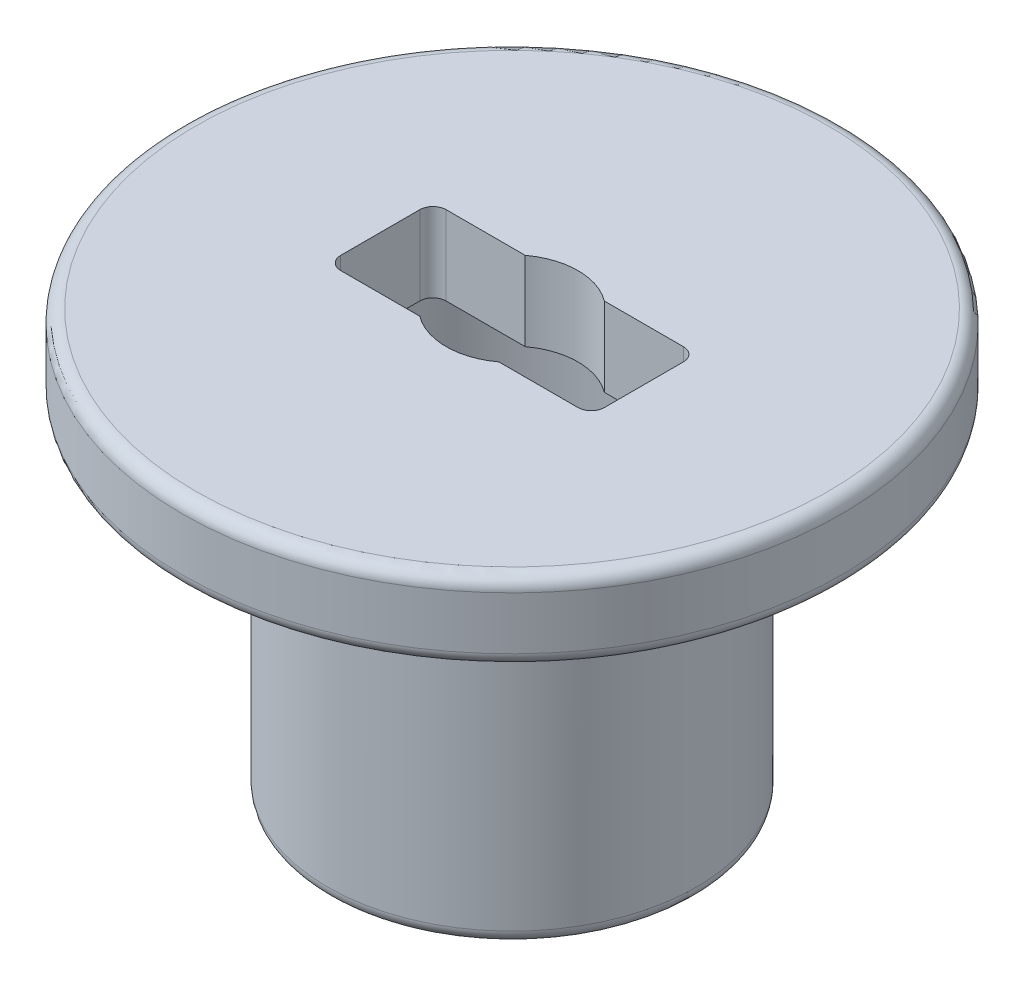
ISO-10303-21;
HEADER;
FILE_DESCRIPTION(('STEP AP214'),'2;1');
FILE_NAME('part.step','',(''),(''),'','','');
FILE_SCHEMA(('AUTOMOTIVE_DESIGN { 1 0 10303 214 1 1 1 1 }'));
ENDSEC;
DATA;
#1=APPLICATION_CONTEXT('core data for automotive mechanical design processes');
#2=APPLICATION_PROTOCOL_DEFINITION('international standard','automotive_design',2000,#1);
#3=PRODUCT_CONTEXT('',#1,'mechanical');
#4=PRODUCT('Part','Part','',(#3));
#5=PRODUCT_RELATED_PRODUCT_CATEGORY('part','',(#4));
#6=PRODUCT_DEFINITION_FORMATION('','',#4);
#7=PRODUCT_DEFINITION_CONTEXT('part definition',#1,'design');
#8=PRODUCT_DEFINITION('design','',#6,#7);
#9=PRODUCT_DEFINITION_SHAPE('','',#8);
#10=(LENGTH_UNIT() NAMED_UNIT(*) SI_UNIT(.MILLI.,.METRE.));
#11=(NAMED_UNIT(*) PLANE_ANGLE_UNIT() SI_UNIT($,.RADIAN.));
#12=(NAMED_UNIT(*) SI_UNIT($,.STERADIAN.) SOLID_ANGLE_UNIT());
#13=UNCERTAINTY_MEASURE_WITH_UNIT(LENGTH_MEASURE(1.E-05),#10,'distance_accuracy_value','');
#14=(GEOMETRIC_REPRESENTATION_CONTEXT(3) GLOBAL_UNCERTAINTY_ASSIGNED_CONTEXT((#13)) GLOBAL_UNIT_ASSIGNED_CONTEXT((#10,
#11,#12)) REPRESENTATION_CONTEXT('',''));
#15=CARTESIAN_POINT('',(0.,0.,0.));
#16=DIRECTION('',(0.,0.,1.));
#17=DIRECTION('',(1.,0.,0.));
#18=AXIS2_PLACEMENT_3D('',#15,#16,#17);
#19=CARTESIAN_POINT('',(0.,3.,0.));
#20=DIRECTION('',(0.,1.,0.));
#21=DIRECTION('',(0.,0.,1.));
#22=AXIS2_PLACEMENT_3D('',#19,#20,#21);
#23=PLANE('',#22);
#24=CARTESIAN_POINT('',(0.,3.,0.));
#25=DIRECTION('',(0.,1.,0.));
#26=DIRECTION('',(0.,0.,1.));
#27=AXIS2_PLACEMENT_3D('',#24,#25,#26);
#28=CIRCLE('',#27,12.);
#29=CARTESIAN_POINT('',(0.,3.,12.));
#30=VERTEX_POINT('',#29);
#31=EDGE_CURVE('E211',#30,#30,#28,.T.);
#32=ORIENTED_EDGE('',*,*,#31,.T.);
#33=EDGE_LOOP('',(#32));
#34=FACE_BOUND('',#33,.T.);
#35=DIRECTION('',(1.,0.,0.));
#36=VECTOR('',#35,1.);
#37=CARTESIAN_POINT('',(1.5,3.,2.));
#38=LINE('',#37,#36);
#39=CARTESIAN_POINT('',(1.5,3.,2.));
#40=VERTEX_POINT('',#39);
#41=CARTESIAN_POINT('',(4.5,3.,2.));
#42=VERTEX_POINT('',#41);
#43=EDGE_CURVE('E325',#40,#42,#38,.T.);
#44=ORIENTED_EDGE('',*,*,#43,.F.);
#45=CARTESIAN_POINT('',(0.,3.,0.));
#46=DIRECTION('',(0.,1.,0.));
#47=DIRECTION('',(0.,0.,1.));
#48=AXIS2_PLACEMENT_3D('',#45,#46,#47);
#49=CIRCLE('',#48,2.5);
#50=CARTESIAN_POINT('',(-1.5,3.,2.));
#51=VERTEX_POINT('',#50);
#52=EDGE_CURVE('E170',#51,#40,#49,.T.);
#53=ORIENTED_EDGE('',*,*,#52,.F.);
#54=DIRECTION('',(1.,0.,0.));
#55=VECTOR('',#54,1.);
#56=CARTESIAN_POINT('',(-4.49999999999999,3.,2.));
#57=LINE('',#56,#55);
#58=CARTESIAN_POINT('',(-4.49999999999999,3.,2.));
#59=VERTEX_POINT('',#58);
#60=EDGE_CURVE('E57',#59,#51,#57,.T.);
#61=ORIENTED_EDGE('',*,*,#60,.F.);
#62=CARTESIAN_POINT('',(-4.5,3.,1.5));
#63=DIRECTION('',(0.,1.,0.));
#64=DIRECTION('',(0.,0.,1.));
#65=AXIS2_PLACEMENT_3D('',#62,#63,#64);
#66=CIRCLE('',#65,0.5);
#67=CARTESIAN_POINT('',(-5.,3.,1.5));
#68=VERTEX_POINT('',#67);
#69=EDGE_CURVE('E134',#68,#59,#66,.T.);
#70=ORIENTED_EDGE('',*,*,#69,.F.);
#71=DIRECTION('',(0.,0.,1.));
#72=VECTOR('',#71,1.);
#73=CARTESIAN_POINT('',(-5.,3.,-1.5));
#74=LINE('',#73,#72);
#75=CARTESIAN_POINT('',(-5.,3.,-1.5));
#76=VERTEX_POINT('',#75);
#77=EDGE_CURVE('E122',#76,#68,#74,.T.);
#78=ORIENTED_EDGE('',*,*,#77,.F.);
#79=CARTESIAN_POINT('',(-4.5,3.,-1.5));
#80=DIRECTION('',(0.,1.,0.));
#81=DIRECTION('',(0.,0.,1.));
#82=AXIS2_PLACEMENT_3D('',#79,#80,#81);
#83=CIRCLE('',#82,0.5);
#84=CARTESIAN_POINT('',(-4.5,3.,-2.));
#85=VERTEX_POINT('',#84);
#86=EDGE_CURVE('E110',#85,#76,#83,.T.);
#87=ORIENTED_EDGE('',*,*,#86,.F.);
#88=DIRECTION('',(-1.,0.,0.));
#89=VECTOR('',#88,1.);
#90=CARTESIAN_POINT('',(-4.5,3.,-2.));
#91=LINE('',#90,#89);
#92=CARTESIAN_POINT('',(-1.5,3.,-2.));
#93=VERTEX_POINT('',#92);
#94=EDGE_CURVE('E123',#93,#85,#91,.T.);
#95=ORIENTED_EDGE('',*,*,#94,.F.);
#96=CARTESIAN_POINT('',(0.,3.,0.));
#97=DIRECTION('',(0.,1.,0.));
#98=DIRECTION('',(0.,0.,1.));
#99=AXIS2_PLACEMENT_3D('',#96,#97,#98);
#100=CIRCLE('',#99,2.5);
#101=CARTESIAN_POINT('',(1.5,3.,-2.));
#102=VERTEX_POINT('',#101);
#103=EDGE_CURVE('E339',#102,#93,#100,.T.);
#104=ORIENTED_EDGE('',*,*,#103,.F.);
#105=DIRECTION('',(-1.,0.,0.));
#106=VECTOR('',#105,1.);
#107=CARTESIAN_POINT('',(1.5,3.,-2.));
#108=LINE('',#107,#106);
#109=CARTESIAN_POINT('',(4.5,3.,-2.));
#110=VERTEX_POINT('',#109);
#111=EDGE_CURVE('E337',#110,#102,#108,.T.);
#112=ORIENTED_EDGE('',*,*,#111,.F.);
#113=CARTESIAN_POINT('',(4.5,3.,-1.5));
#114=DIRECTION('',(0.,1.,0.));
#115=DIRECTION('',(0.,0.,-1.));
#116=AXIS2_PLACEMENT_3D('',#113,#114,#115);
#117=CIRCLE('',#116,0.5);
#118=CARTESIAN_POINT('',(5.,3.,-1.5));
#119=VERTEX_POINT('',#118);
#120=EDGE_CURVE('E335',#119,#110,#117,.T.);
#121=ORIENTED_EDGE('',*,*,#120,.F.);
#122=DIRECTION('',(0.,0.,-1.));
#123=VECTOR('',#122,1.);
#124=CARTESIAN_POINT('',(5.,3.,-1.5));
#125=LINE('',#124,#123);
#126=CARTESIAN_POINT('',(5.,3.,1.5));
#127=VERTEX_POINT('',#126);
#128=EDGE_CURVE('E333',#127,#119,#125,.T.);
#129=ORIENTED_EDGE('',*,*,#128,.F.);
#130=CARTESIAN_POINT('',(4.5,3.,1.5));
#131=DIRECTION('',(0.,1.,0.));
#132=DIRECTION('',(0.,0.,1.));
#133=AXIS2_PLACEMENT_3D('',#130,#131,#132);
#134=CIRCLE('',#133,0.5);
#135=EDGE_CURVE('E327',#42,#127,#134,.T.);
#136=ORIENTED_EDGE('',*,*,#135,.F.);
#137=EDGE_LOOP('',(#44,#53,#61,#70,#78,#87,#95,#104,#112,#121,#129,#136));
#138=FACE_BOUND('',#137,.T.);
#139=ADVANCED_FACE('F36',(#34,#138),#23,.T.);
#140=CARTESIAN_POINT('',(0.,0.,0.));
#141=DIRECTION('',(0.,1.,0.));
#142=DIRECTION('',(0.,0.,1.));
#143=AXIS2_PLACEMENT_3D('',#140,#141,#142);
#144=PLANE('',#143);
#145=CARTESIAN_POINT('',(0.,0.,0.));
#146=DIRECTION('',(0.,1.,0.));
#147=DIRECTION('',(0.,0.,1.));
#148=AXIS2_PLACEMENT_3D('',#145,#146,#147);
#149=CIRCLE('',#148,12.);
#150=CARTESIAN_POINT('',(0.,0.,12.));
#151=VERTEX_POINT('',#150);
#152=EDGE_CURVE('E208',#151,#151,#149,.F.);
#153=ORIENTED_EDGE('',*,*,#152,.T.);
#154=EDGE_LOOP('',(#153));
#155=FACE_BOUND('',#154,.T.);
#156=CARTESIAN_POINT('',(0.,0.,0.));
#157=DIRECTION('',(0.,1.,0.));
#158=DIRECTION('',(0.,0.,1.));
#159=AXIS2_PLACEMENT_3D('',#156,#157,#158);
#160=CIRCLE('',#159,7.);
#161=CARTESIAN_POINT('',(0.,0.,7.));
#162=VERTEX_POINT('',#161);
#163=EDGE_CURVE('E199',#162,#162,#160,.F.);
#164=ORIENTED_EDGE('',*,*,#163,.F.);
#165=EDGE_LOOP('',(#164));
#166=FACE_BOUND('',#165,.T.);
#167=CARTESIAN_POINT('',(-10.5,0.,0.));
#168=DIRECTION('',(0.,1.,0.));
#169=DIRECTION('',(0.,0.,1.));
#170=AXIS2_PLACEMENT_3D('',#167,#168,#169);
#171=CIRCLE('',#170,1.);
#172=CARTESIAN_POINT('',(-10.5,0.,1.));
#173=VERTEX_POINT('',#172);
#174=EDGE_CURVE('E196',#173,#173,#171,.F.);
#175=ORIENTED_EDGE('',*,*,#174,.F.);
#176=EDGE_LOOP('',(#175));
#177=FACE_BOUND('',#176,.T.);
#178=ADVANCED_FACE('F229',(#155,#166,#177),#144,.F.);
#179=CARTESIAN_POINT('',(0.,3.,0.));
#180=DIRECTION('',(0.,-1.,0.));
#181=DIRECTION('',(0.,0.,-1.));
#182=AXIS2_PLACEMENT_3D('',#179,#180,#181);
#183=CYLINDRICAL_SURFACE('',#182,12.5);
#184=CARTESIAN_POINT('',(0.,0.5,0.));
#185=DIRECTION('',(0.,1.,0.));
#186=DIRECTION('',(0.,0.,1.));
#187=AXIS2_PLACEMENT_3D('',#184,#185,#186);
#188=CIRCLE('',#187,12.5);
#189=CARTESIAN_POINT('',(0.,0.5,12.5));
#190=VERTEX_POINT('',#189);
#191=EDGE_CURVE('E205',#190,#190,#188,.T.);
#192=ORIENTED_EDGE('',*,*,#191,.T.);
#193=EDGE_LOOP('',(#192));
#194=FACE_BOUND('',#193,.T.);
#195=CARTESIAN_POINT('',(0.,2.5,0.));
#196=DIRECTION('',(0.,1.,0.));
#197=DIRECTION('',(0.,0.,1.));
#198=AXIS2_PLACEMENT_3D('',#195,#196,#197);
#199=CIRCLE('',#198,12.5);
#200=CARTESIAN_POINT('',(0.,2.5,12.5));
#201=VERTEX_POINT('',#200);
#202=EDGE_CURVE('E202',#201,#201,#199,.F.);
#203=ORIENTED_EDGE('',*,*,#202,.T.);
#204=EDGE_LOOP('',(#203));
#205=FACE_BOUND('',#204,.T.);
#206=ADVANCED_FACE('F235',(#194,#205),#183,.T.);
#207=CARTESIAN_POINT('',(0.,3.,0.));
#208=DIRECTION('',(0.,-1.,0.));
#209=DIRECTION('',(0.,0.,-1.));
#210=AXIS2_PLACEMENT_3D('',#207,#208,#209);
#211=CYLINDRICAL_SURFACE('',#210,2.5);
#212=CARTESIAN_POINT('',(0.,0.,0.));
#213=DIRECTION('',(0.,1.,0.));
#214=DIRECTION('',(0.,0.,1.));
#215=AXIS2_PLACEMENT_3D('',#212,#213,#214);
#216=CIRCLE('',#215,2.5);
#217=CARTESIAN_POINT('',(-1.5,0.,2.));
#218=VERTEX_POINT('',#217);
#219=CARTESIAN_POINT('',(1.5,0.,2.));
#220=VERTEX_POINT('',#219);
#221=EDGE_CURVE('E80',#218,#220,#216,.T.);
#222=ORIENTED_EDGE('',*,*,#221,.F.);
#223=DIRECTION('',(0.,-1.,0.));
#224=VECTOR('',#223,1.);
#225=CARTESIAN_POINT('',(-1.5,3.,2.));
#226=LINE('',#225,#224);
#227=EDGE_CURVE('E140',#51,#218,#226,.T.);
#228=ORIENTED_EDGE('',*,*,#227,.F.);
#229=ORIENTED_EDGE('',*,*,#52,.T.);
#230=DIRECTION('',(0.,-1.,0.));
#231=VECTOR('',#230,1.);
#232=CARTESIAN_POINT('',(1.5,3.,2.));
#233=LINE('',#232,#231);
#234=EDGE_CURVE('E193',#40,#220,#233,.T.);
#235=ORIENTED_EDGE('',*,*,#234,.T.);
#236=EDGE_LOOP('',(#222,#228,#229,#235));
#237=FACE_BOUND('',#236,.T.);
#238=ADVANCED_FACE('F239',(#237),#211,.F.);
#239=CARTESIAN_POINT('',(1.5,3.,2.));
#240=DIRECTION('',(0.,0.,-1.));
#241=DIRECTION('',(-1.,0.,0.));
#242=AXIS2_PLACEMENT_3D('',#239,#240,#241);
#243=PLANE('',#242);
#244=DIRECTION('',(1.,0.,0.));
#245=VECTOR('',#244,1.);
#246=CARTESIAN_POINT('',(1.5,0.,2.));
#247=LINE('',#246,#245);
#248=CARTESIAN_POINT('',(4.5,0.,2.));
#249=VERTEX_POINT('',#248);
#250=EDGE_CURVE('E142',#220,#249,#247,.T.);
#251=ORIENTED_EDGE('',*,*,#250,.F.);
#252=ORIENTED_EDGE('',*,*,#234,.F.);
#253=ORIENTED_EDGE('',*,*,#43,.T.);
#254=DIRECTION('',(0.,-1.,0.));
#255=VECTOR('',#254,1.);
#256=CARTESIAN_POINT('',(4.5,3.,2.));
#257=LINE('',#256,#255);
#258=EDGE_CURVE('E190',#42,#249,#257,.T.);
#259=ORIENTED_EDGE('',*,*,#258,.T.);
#260=EDGE_LOOP('',(#251,#252,#253,#259));
#261=FACE_BOUND('',#260,.T.);
#262=ADVANCED_FACE('F312',(#261),#243,.T.);
#263=CARTESIAN_POINT('',(4.5,3.,1.5));
#264=DIRECTION('',(0.,-1.,0.));
#265=DIRECTION('',(0.,0.,-1.));
#266=AXIS2_PLACEMENT_3D('',#263,#264,#265);
#267=CYLINDRICAL_SURFACE('',#266,0.5);
#268=CARTESIAN_POINT('',(4.5,0.,1.5));
#269=DIRECTION('',(0.,1.,0.));
#270=DIRECTION('',(0.,0.,1.));
#271=AXIS2_PLACEMENT_3D('',#268,#269,#270);
#272=CIRCLE('',#271,0.5);
#273=CARTESIAN_POINT('',(5.,0.,1.5));
#274=VERTEX_POINT('',#273);
#275=EDGE_CURVE('E145',#249,#274,#272,.T.);
#276=ORIENTED_EDGE('',*,*,#275,.F.);
#277=ORIENTED_EDGE('',*,*,#258,.F.);
#278=ORIENTED_EDGE('',*,*,#135,.T.);
#279=DIRECTION('',(0.,-1.,0.));
#280=VECTOR('',#279,1.);
#281=CARTESIAN_POINT('',(5.,3.,1.5));
#282=LINE('',#281,#280);
#283=EDGE_CURVE('E187',#127,#274,#282,.T.);
#284=ORIENTED_EDGE('',*,*,#283,.T.);
#285=EDGE_LOOP('',(#276,#277,#278,#284));
#286=FACE_BOUND('',#285,.T.);
#287=ADVANCED_FACE('F309',(#286),#267,.F.);
#288=CARTESIAN_POINT('',(5.,3.,-1.5));
#289=DIRECTION('',(-1.,0.,0.));
#290=DIRECTION('',(0.,0.,1.));
#291=AXIS2_PLACEMENT_3D('',#288,#289,#290);
#292=PLANE('',#291);
#293=DIRECTION('',(0.,0.,-1.));
#294=VECTOR('',#293,1.);
#295=CARTESIAN_POINT('',(5.,0.,-1.5));
#296=LINE('',#295,#294);
#297=CARTESIAN_POINT('',(5.,0.,-1.5));
#298=VERTEX_POINT('',#297);
#299=EDGE_CURVE('E148',#274,#298,#296,.T.);
#300=ORIENTED_EDGE('',*,*,#299,.F.);
#301=ORIENTED_EDGE('',*,*,#283,.F.);
#302=ORIENTED_EDGE('',*,*,#128,.T.);
#303=DIRECTION('',(0.,-1.,0.));
#304=VECTOR('',#303,1.);
#305=CARTESIAN_POINT('',(5.,3.,-1.5));
#306=LINE('',#305,#304);
#307=EDGE_CURVE('E184',#119,#298,#306,.T.);
#308=ORIENTED_EDGE('',*,*,#307,.T.);
#309=EDGE_LOOP('',(#300,#301,#302,#308));
#310=FACE_BOUND('',#309,.T.);
#311=ADVANCED_FACE('F305',(#310),#292,.T.);
#312=CARTESIAN_POINT('',(4.5,3.,-1.5));
#313=DIRECTION('',(0.,-1.,0.));
#314=DIRECTION('',(0.,0.,-1.));
#315=AXIS2_PLACEMENT_3D('',#312,#313,#314);
#316=CYLINDRICAL_SURFACE('',#315,0.5);
#317=CARTESIAN_POINT('',(4.5,0.,-1.5));
#318=DIRECTION('',(0.,1.,0.));
#319=DIRECTION('',(0.,0.,-1.));
#320=AXIS2_PLACEMENT_3D('',#317,#318,#319);
#321=CIRCLE('',#320,0.5);
#322=CARTESIAN_POINT('',(4.5,0.,-2.));
#323=VERTEX_POINT('',#322);
#324=EDGE_CURVE('E151',#298,#323,#321,.T.);
#325=ORIENTED_EDGE('',*,*,#324,.F.);
#326=ORIENTED_EDGE('',*,*,#307,.F.);
#327=ORIENTED_EDGE('',*,*,#120,.T.);
#328=DIRECTION('',(0.,-1.,0.));
#329=VECTOR('',#328,1.);
#330=CARTESIAN_POINT('',(4.5,3.,-2.));
#331=LINE('',#330,#329);
#332=EDGE_CURVE('E181',#110,#323,#331,.T.);
#333=ORIENTED_EDGE('',*,*,#332,.T.);
#334=EDGE_LOOP('',(#325,#326,#327,#333));
#335=FACE_BOUND('',#334,.T.);
#336=ADVANCED_FACE('F301',(#335),#316,.F.);
#337=CARTESIAN_POINT('',(1.5,3.,-2.));
#338=DIRECTION('',(0.,0.,1.));
#339=DIRECTION('',(1.,0.,0.));
#340=AXIS2_PLACEMENT_3D('',#337,#338,#339);
#341=PLANE('',#340);
#342=DIRECTION('',(-1.,0.,0.));
#343=VECTOR('',#342,1.);
#344=CARTESIAN_POINT('',(1.5,0.,-2.));
#345=LINE('',#344,#343);
#346=CARTESIAN_POINT('',(1.5,0.,-2.));
#347=VERTEX_POINT('',#346);
#348=EDGE_CURVE('E154',#323,#347,#345,.T.);
#349=ORIENTED_EDGE('',*,*,#348,.F.);
#350=ORIENTED_EDGE('',*,*,#332,.F.);
#351=ORIENTED_EDGE('',*,*,#111,.T.);
#352=DIRECTION('',(0.,-1.,0.));
#353=VECTOR('',#352,1.);
#354=CARTESIAN_POINT('',(1.5,3.,-2.));
#355=LINE('',#354,#353);
#356=EDGE_CURVE('E178',#102,#347,#355,.T.);
#357=ORIENTED_EDGE('',*,*,#356,.T.);
#358=EDGE_LOOP('',(#349,#350,#351,#357));
#359=FACE_BOUND('',#358,.T.);
#360=ADVANCED_FACE('F297',(#359),#341,.T.);
#361=CARTESIAN_POINT('',(0.,3.,0.));
#362=DIRECTION('',(0.,-1.,0.));
#363=DIRECTION('',(0.,0.,-1.));
#364=AXIS2_PLACEMENT_3D('',#361,#362,#363);
#365=CYLINDRICAL_SURFACE('',#364,2.5);
#366=CARTESIAN_POINT('',(0.,0.,0.));
#367=DIRECTION('',(0.,1.,0.));
#368=DIRECTION('',(0.,0.,1.));
#369=AXIS2_PLACEMENT_3D('',#366,#367,#368);
#370=CIRCLE('',#369,2.5);
#371=CARTESIAN_POINT('',(-1.5,0.,-2.));
#372=VERTEX_POINT('',#371);
#373=EDGE_CURVE('E157',#347,#372,#370,.T.);
#374=ORIENTED_EDGE('',*,*,#373,.F.);
#375=ORIENTED_EDGE('',*,*,#356,.F.);
#376=ORIENTED_EDGE('',*,*,#103,.T.);
#377=DIRECTION('',(0.,-1.,0.));
#378=VECTOR('',#377,1.);
#379=CARTESIAN_POINT('',(-1.5,3.,-2.));
#380=LINE('',#379,#378);
#381=EDGE_CURVE('E175',#93,#372,#380,.T.);
#382=ORIENTED_EDGE('',*,*,#381,.T.);
#383=EDGE_LOOP('',(#374,#375,#376,#382));
#384=FACE_BOUND('',#383,.T.);
#385=ADVANCED_FACE('F293',(#384),#365,.F.);
#386=CARTESIAN_POINT('',(-4.5,3.,-2.));
#387=DIRECTION('',(0.,0.,1.));
#388=DIRECTION('',(1.,0.,0.));
#389=AXIS2_PLACEMENT_3D('',#386,#387,#388);
#390=PLANE('',#389);
#391=DIRECTION('',(-1.,0.,0.));
#392=VECTOR('',#391,1.);
#393=CARTESIAN_POINT('',(-4.5,0.,-2.));
#394=LINE('',#393,#392);
#395=CARTESIAN_POINT('',(-4.5,0.,-2.));
#396=VERTEX_POINT('',#395);
#397=EDGE_CURVE('E160',#372,#396,#394,.T.);
#398=ORIENTED_EDGE('',*,*,#397,.F.);
#399=ORIENTED_EDGE('',*,*,#381,.F.);
#400=ORIENTED_EDGE('',*,*,#94,.T.);
#401=DIRECTION('',(0.,-1.,0.));
#402=VECTOR('',#401,1.);
#403=CARTESIAN_POINT('',(-4.5,3.,-2.));
#404=LINE('',#403,#402);
#405=EDGE_CURVE('E118',#85,#396,#404,.T.);
#406=ORIENTED_EDGE('',*,*,#405,.T.);
#407=EDGE_LOOP('',(#398,#399,#400,#406));
#408=FACE_BOUND('',#407,.T.);
#409=ADVANCED_FACE('F290',(#408),#390,.T.);
#410=CARTESIAN_POINT('',(-4.5,3.,-1.5));
#411=DIRECTION('',(0.,-1.,0.));
#412=DIRECTION('',(0.,0.,-1.));
#413=AXIS2_PLACEMENT_3D('',#410,#411,#412);
#414=CYLINDRICAL_SURFACE('',#413,0.5);
#415=CARTESIAN_POINT('',(-4.5,0.,-1.5));
#416=DIRECTION('',(0.,1.,0.));
#417=DIRECTION('',(0.,0.,1.));
#418=AXIS2_PLACEMENT_3D('',#415,#416,#417);
#419=CIRCLE('',#418,0.5);
#420=CARTESIAN_POINT('',(-5.,0.,-1.5));
#421=VERTEX_POINT('',#420);
#422=EDGE_CURVE('E163',#396,#421,#419,.T.);
#423=ORIENTED_EDGE('',*,*,#422,.F.);
#424=ORIENTED_EDGE('',*,*,#405,.F.);
#425=ORIENTED_EDGE('',*,*,#86,.T.);
#426=DIRECTION('',(0.,-1.,0.));
#427=VECTOR('',#426,1.);
#428=CARTESIAN_POINT('',(-5.,3.,-1.5));
#429=LINE('',#428,#427);
#430=EDGE_CURVE('E115',#76,#421,#429,.T.);
#431=ORIENTED_EDGE('',*,*,#430,.T.);
#432=EDGE_LOOP('',(#423,#424,#425,#431));
#433=FACE_BOUND('',#432,.T.);
#434=ADVANCED_FACE('F113',(#433),#414,.F.);
#435=CARTESIAN_POINT('',(-5.,3.,-1.5));
#436=DIRECTION('',(1.,0.,0.));
#437=DIRECTION('',(0.,0.,-1.));
#438=AXIS2_PLACEMENT_3D('',#435,#436,#437);
#439=PLANE('',#438);
#440=DIRECTION('',(0.,0.,1.));
#441=VECTOR('',#440,1.);
#442=CARTESIAN_POINT('',(-5.,0.,-1.5));
#443=LINE('',#442,#441);
#444=CARTESIAN_POINT('',(-5.,0.,1.5));
#445=VERTEX_POINT('',#444);
#446=EDGE_CURVE('E129',#421,#445,#443,.T.);
#447=ORIENTED_EDGE('',*,*,#446,.F.);
#448=ORIENTED_EDGE('',*,*,#430,.F.);
#449=ORIENTED_EDGE('',*,*,#77,.T.);
#450=DIRECTION('',(0.,-1.,0.));
#451=VECTOR('',#450,1.);
#452=CARTESIAN_POINT('',(-5.,3.,1.5));
#453=LINE('',#452,#451);
#454=EDGE_CURVE('E130',#68,#445,#453,.T.);
#455=ORIENTED_EDGE('',*,*,#454,.T.);
#456=EDGE_LOOP('',(#447,#448,#449,#455));
#457=FACE_BOUND('',#456,.T.);
#458=ADVANCED_FACE('F126',(#457),#439,.T.);
#459=CARTESIAN_POINT('',(-4.5,3.,1.5));
#460=DIRECTION('',(0.,-1.,0.));
#461=DIRECTION('',(0.,0.,-1.));
#462=AXIS2_PLACEMENT_3D('',#459,#460,#461);
#463=CYLINDRICAL_SURFACE('',#462,0.5);
#464=CARTESIAN_POINT('',(-4.5,0.,1.5));
#465=DIRECTION('',(0.,1.,0.));
#466=DIRECTION('',(0.,0.,1.));
#467=AXIS2_PLACEMENT_3D('',#464,#465,#466);
#468=CIRCLE('',#467,0.5);
#469=CARTESIAN_POINT('',(-4.49999999999999,0.,2.));
#470=VERTEX_POINT('',#469);
#471=EDGE_CURVE('E71',#445,#470,#468,.T.);
#472=ORIENTED_EDGE('',*,*,#471,.F.);
#473=ORIENTED_EDGE('',*,*,#454,.F.);
#474=ORIENTED_EDGE('',*,*,#69,.T.);
#475=DIRECTION('',(0.,-1.,0.));
#476=VECTOR('',#475,1.);
#477=CARTESIAN_POINT('',(-4.49999999999999,3.,2.));
#478=LINE('',#477,#476);
#479=EDGE_CURVE('E51',#59,#470,#478,.T.);
#480=ORIENTED_EDGE('',*,*,#479,.T.);
#481=EDGE_LOOP('',(#472,#473,#474,#480));
#482=FACE_BOUND('',#481,.T.);
#483=ADVANCED_FACE('F278',(#482),#463,.F.);
#484=CARTESIAN_POINT('',(-4.49999999999999,3.,2.));
#485=DIRECTION('',(0.,0.,-1.));
#486=DIRECTION('',(-1.,0.,0.));
#487=AXIS2_PLACEMENT_3D('',#484,#485,#486);
#488=PLANE('',#487);
#489=DIRECTION('',(1.,0.,0.));
#490=VECTOR('',#489,1.);
#491=CARTESIAN_POINT('',(-4.49999999999999,0.,2.));
#492=LINE('',#491,#490);
#493=EDGE_CURVE('E168',#470,#218,#492,.T.);
#494=ORIENTED_EDGE('',*,*,#493,.F.);
#495=ORIENTED_EDGE('',*,*,#479,.F.);
#496=ORIENTED_EDGE('',*,*,#60,.T.);
#497=ORIENTED_EDGE('',*,*,#227,.T.);
#498=EDGE_LOOP('',(#494,#495,#496,#497));
#499=FACE_BOUND('',#498,.T.);
#500=ADVANCED_FACE('F268',(#499),#488,.T.);
#501=CARTESIAN_POINT('',(-10.5,-3.,0.));
#502=DIRECTION('',(0.,1.,0.));
#503=DIRECTION('',(0.,0.,1.));
#504=AXIS2_PLACEMENT_3D('',#501,#502,#503);
#505=CYLINDRICAL_SURFACE('',#504,1.);
#506=CARTESIAN_POINT('',(-10.5,-3.,0.));
#507=DIRECTION('',(0.,-1.,0.));
#508=DIRECTION('',(0.,0.,-1.));
#509=AXIS2_PLACEMENT_3D('',#506,#507,#508);
#510=CIRCLE('',#509,1.);
#511=CARTESIAN_POINT('',(-10.5,-3.,-1.));
#512=VERTEX_POINT('',#511);
#513=EDGE_CURVE('E143',#512,#512,#510,.T.);
#514=ORIENTED_EDGE('',*,*,#513,.F.);
#515=EDGE_LOOP('',(#514));
#516=FACE_BOUND('',#515,.T.);
#517=ORIENTED_EDGE('',*,*,#174,.T.);
#518=EDGE_LOOP('',(#517));
#519=FACE_BOUND('',#518,.T.);
#520=ADVANCED_FACE('F265',(#516,#519),#505,.T.);
#521=CARTESIAN_POINT('',(-10.5,-3.,0.));
#522=DIRECTION('',(0.,-1.,0.));
#523=DIRECTION('',(0.,0.,-1.));
#524=AXIS2_PLACEMENT_3D('',#521,#522,#523);
#525=PLANE('',#524);
#526=ORIENTED_EDGE('',*,*,#513,.T.);
#527=EDGE_LOOP('',(#526));
#528=FACE_BOUND('',#527,.T.);
#529=ADVANCED_FACE('F267',(#528),#525,.T.);
#530=CARTESIAN_POINT('',(0.,-13.,0.));
#531=DIRECTION('',(0.,1.,0.));
#532=DIRECTION('',(0.,0.,1.));
#533=AXIS2_PLACEMENT_3D('',#530,#531,#532);
#534=CYLINDRICAL_SURFACE('',#533,7.);
#535=CARTESIAN_POINT('',(0.,-12.5,0.));
#536=DIRECTION('',(0.,-1.,0.));
#537=DIRECTION('',(0.,0.,-1.));
#538=AXIS2_PLACEMENT_3D('',#535,#536,#537);
#539=CIRCLE('',#538,7.);
#540=CARTESIAN_POINT('',(0.,-12.5,7.));
#541=VERTEX_POINT('',#540);
#542=EDGE_CURVE('E11',#541,#541,#539,.F.);
#543=CARTESIAN_POINT('',(0.,-12.5,7.));
#544=CARTESIAN_POINT('',(0.,-12.3697916666667,7.));
#545=CARTESIAN_POINT('',(0.,-12.2395833333333,7.));
#546=CARTESIAN_POINT('',(0.,-11.9791666666667,7.));
#547=CARTESIAN_POINT('',(0.,-11.8489583333333,7.));
#548=CARTESIAN_POINT('',(0.,-11.5885416666667,7.));
#549=CARTESIAN_POINT('',(0.,-11.4583333333333,7.));
#550=CARTESIAN_POINT('',(0.,-11.1979166666667,7.));
#551=CARTESIAN_POINT('',(0.,-11.0677083333333,7.));
#552=CARTESIAN_POINT('',(0.,-10.8072916666667,7.));
#553=CARTESIAN_POINT('',(0.,-10.6770833333333,7.));
#554=CARTESIAN_POINT('',(0.,-10.4166666666667,7.));
#555=CARTESIAN_POINT('',(0.,-10.2864583333333,7.));
#556=CARTESIAN_POINT('',(0.,-10.0260416666667,7.));
#557=CARTESIAN_POINT('',(0.,-9.89583333333333,7.));
#558=CARTESIAN_POINT('',(0.,-9.63541666666667,7.));
#559=CARTESIAN_POINT('',(0.,-9.50520833333333,7.));
#560=CARTESIAN_POINT('',(0.,-9.24479166666666,7.));
#561=CARTESIAN_POINT('',(0.,-9.11458333333333,7.));
#562=CARTESIAN_POINT('',(0.,-8.85416666666667,7.));
#563=CARTESIAN_POINT('',(0.,-8.72395833333333,7.));
#564=CARTESIAN_POINT('',(0.,-8.46354166666667,7.));
#565=CARTESIAN_POINT('',(0.,-8.33333333333333,7.));
#566=CARTESIAN_POINT('',(0.,-8.07291666666667,7.));
#567=CARTESIAN_POINT('',(0.,-7.94270833333333,7.));
#568=CARTESIAN_POINT('',(0.,-7.68229166666667,7.));
#569=CARTESIAN_POINT('',(0.,-7.55208333333333,7.));
#570=CARTESIAN_POINT('',(0.,-7.29166666666667,7.));
#571=CARTESIAN_POINT('',(0.,-7.16145833333333,7.));
#572=CARTESIAN_POINT('',(0.,-6.90104166666667,7.));
#573=CARTESIAN_POINT('',(0.,-6.77083333333333,7.));
#574=CARTESIAN_POINT('',(0.,-6.51041666666667,7.));
#575=CARTESIAN_POINT('',(0.,-6.38020833333333,7.));
#576=CARTESIAN_POINT('',(0.,-6.11979166666667,7.));
#577=CARTESIAN_POINT('',(0.,-5.98958333333333,7.));
#578=CARTESIAN_POINT('',(0.,-5.72916666666667,7.));
#579=CARTESIAN_POINT('',(0.,-5.59895833333333,7.));
#580=CARTESIAN_POINT('',(0.,-5.33854166666667,7.));
#581=CARTESIAN_POINT('',(0.,-5.20833333333333,7.));
#582=CARTESIAN_POINT('',(0.,-4.94791666666667,7.));
#583=CARTESIAN_POINT('',(0.,-4.81770833333333,7.));
#584=CARTESIAN_POINT('',(0.,-4.55729166666667,7.));
#585=CARTESIAN_POINT('',(0.,-4.42708333333333,7.));
#586=CARTESIAN_POINT('',(0.,-4.16666666666667,7.));
#587=CARTESIAN_POINT('',(0.,-4.03645833333333,7.));
#588=CARTESIAN_POINT('',(0.,-3.77604166666667,7.));
#589=CARTESIAN_POINT('',(0.,-3.64583333333333,7.));
#590=CARTESIAN_POINT('',(0.,-3.38541666666667,7.));
#591=CARTESIAN_POINT('',(0.,-3.25520833333333,7.));
#592=CARTESIAN_POINT('',(0.,-2.99479166666667,7.));
#593=CARTESIAN_POINT('',(0.,-2.86458333333333,7.));
#594=CARTESIAN_POINT('',(0.,-2.60416666666667,7.));
#595=CARTESIAN_POINT('',(0.,-2.47395833333333,7.));
#596=CARTESIAN_POINT('',(0.,-2.21354166666667,7.));
#597=CARTESIAN_POINT('',(0.,-2.08333333333333,7.));
#598=CARTESIAN_POINT('',(0.,-1.82291666666667,7.));
#599=CARTESIAN_POINT('',(0.,-1.69270833333333,7.));
#600=CARTESIAN_POINT('',(0.,-1.43229166666666,7.));
#601=CARTESIAN_POINT('',(0.,-1.30208333333333,7.));
#602=CARTESIAN_POINT('',(0.,-1.04166666666667,7.));
#603=CARTESIAN_POINT('',(0.,-0.911458333333334,7.));
#604=CARTESIAN_POINT('',(0.,-0.651041666666667,7.));
#605=CARTESIAN_POINT('',(0.,-0.520833333333333,7.));
#606=CARTESIAN_POINT('',(0.,-0.260416666666666,7.));
#607=CARTESIAN_POINT('',(0.,-0.130208333333333,7.));
#608=CARTESIAN_POINT('',(0.,0.,7.));
#609=B_SPLINE_CURVE_WITH_KNOTS('',3,(#543,#544,#545,#546,#547,#548,#549,#550,#551,#552,#553,
#554,#555,#556,#557,#558,#559,#560,#561,#562,#563,#564,#565,#566,#567,#568,#569,#570,#571,#572,
#573,#574,#575,#576,#577,#578,#579,#580,#581,#582,#583,#584,#585,#586,#587,#588,#589,#590,#591,
#592,#593,#594,#595,#596,#597,#598,#599,#600,#601,#602,#603,#604,#605,#606,#607,#608),
.UNSPECIFIED.,.F.,.F.,(4,2,2,2,2,2,2,2,2,2,2,2,2,2,2,2,2,2,2,2,2,2,2,2,2,2,2,2,2,2,2,2,4),(0.,
0.390625,0.781250000000001,1.171875,1.5625,1.953125,2.34375,2.734375,3.125,3.515625,3.90625,
4.296875,4.6875,5.078125,5.46875,5.859375,6.25,6.640625,7.03125,7.421875,7.8125,8.203125,
8.59375,8.984375,9.375,9.765625,10.15625,10.546875,10.9375,11.328125,11.71875,12.109375,12.5),.UNSPECIFIED.);
#610=EDGE_CURVE('BSEAM275',#541,#162,#609,.T.);
#611=ORIENTED_EDGE('',*,*,#542,.T.);
#612=ORIENTED_EDGE('',*,*,#163,.T.);
#613=ORIENTED_EDGE('',*,*,#610,.T.);
#614=ORIENTED_EDGE('',*,*,#610,.F.);
#615=EDGE_LOOP('',(#611,#613,#612,#614));
#616=FACE_BOUND('',#615,.T.);
#617=ADVANCED_FACE('F275',(#616),#534,.T.);
#618=CARTESIAN_POINT('',(0.,-13.,0.));
#619=DIRECTION('',(0.,-1.,0.));
#620=DIRECTION('',(0.,0.,-1.));
#621=AXIS2_PLACEMENT_3D('',#618,#619,#620);
#622=PLANE('',#621);
#623=CARTESIAN_POINT('',(0.,-13.,0.));
#624=DIRECTION('',(0.,-1.,0.));
#625=DIRECTION('',(0.,0.,-1.));
#626=AXIS2_PLACEMENT_3D('',#623,#624,#625);
#627=CIRCLE('',#626,6.5);
#628=CARTESIAN_POINT('',(0.,-13.,-6.5));
#629=VERTEX_POINT('',#628);
#630=EDGE_CURVE('E44',#629,#629,#627,.T.);
#631=ORIENTED_EDGE('',*,*,#630,.T.);
#632=EDGE_LOOP('',(#631));
#633=FACE_BOUND('',#632,.T.);
#634=CARTESIAN_POINT('',(0.,-13.,0.));
#635=DIRECTION('',(0.,-1.,0.));
#636=DIRECTION('',(0.,0.,-1.));
#637=AXIS2_PLACEMENT_3D('',#634,#635,#636);
#638=CIRCLE('',#637,6.);
#639=CARTESIAN_POINT('',(0.,-13.,-6.));
#640=VERTEX_POINT('',#639);
#641=EDGE_CURVE('E370',#640,#640,#638,.F.);
#642=ORIENTED_EDGE('',*,*,#641,.T.);
#643=EDGE_LOOP('',(#642));
#644=FACE_BOUND('',#643,.T.);
#645=ADVANCED_FACE('F216',(#633,#644),#622,.T.);
#646=CARTESIAN_POINT('',(0.,-13.001,0.));
#647=DIRECTION('',(0.,1.,0.));
#648=DIRECTION('',(0.,0.,1.));
#649=AXIS2_PLACEMENT_3D('',#646,#647,#648);
#650=CYLINDRICAL_SURFACE('',#649,6.);
#651=ORIENTED_EDGE('',*,*,#641,.F.);
#652=EDGE_LOOP('',(#651));
#653=FACE_BOUND('',#652,.T.);
#654=CARTESIAN_POINT('',(0.,0.,0.));
#655=DIRECTION('',(0.,1.,0.));
#656=DIRECTION('',(0.,0.,1.));
#657=AXIS2_PLACEMENT_3D('',#654,#655,#656);
#658=CIRCLE('',#657,6.);
#659=CARTESIAN_POINT('',(0.,0.,6.));
#660=VERTEX_POINT('',#659);
#661=EDGE_CURVE('E368',#660,#660,#658,.T.);
#662=ORIENTED_EDGE('',*,*,#661,.T.);
#663=EDGE_LOOP('',(#662));
#664=FACE_BOUND('',#663,.T.);
#665=ADVANCED_FACE('F251',(#653,#664),#650,.F.);
#666=CARTESIAN_POINT('',(0.,0.,0.));
#667=DIRECTION('',(0.,1.,0.));
#668=DIRECTION('',(0.,0.,1.));
#669=AXIS2_PLACEMENT_3D('',#666,#667,#668);
#670=PLANE('',#669);
#671=ORIENTED_EDGE('',*,*,#221,.T.);
#672=ORIENTED_EDGE('',*,*,#250,.T.);
#673=ORIENTED_EDGE('',*,*,#275,.T.);
#674=ORIENTED_EDGE('',*,*,#299,.T.);
#675=ORIENTED_EDGE('',*,*,#324,.T.);
#676=ORIENTED_EDGE('',*,*,#348,.T.);
#677=ORIENTED_EDGE('',*,*,#373,.T.);
#678=ORIENTED_EDGE('',*,*,#397,.T.);
#679=ORIENTED_EDGE('',*,*,#422,.T.);
#680=ORIENTED_EDGE('',*,*,#446,.T.);
#681=ORIENTED_EDGE('',*,*,#471,.T.);
#682=ORIENTED_EDGE('',*,*,#493,.T.);
#683=EDGE_LOOP('',(#671,#672,#673,#674,#675,#676,#677,#678,#679,#680,#681,#682));
#684=FACE_BOUND('',#683,.T.);
#685=ORIENTED_EDGE('',*,*,#661,.F.);
#686=EDGE_LOOP('',(#685));
#687=FACE_BOUND('',#686,.T.);
#688=ADVANCED_FACE('F246',(#684,#687),#670,.F.);
#689=CARTESIAN_POINT('',(0.,0.5,0.));
#690=DIRECTION('',(0.,1.,0.));
#691=DIRECTION('',(0.,0.,1.));
#692=AXIS2_PLACEMENT_3D('',#689,#690,#691);
#693=TOROIDAL_SURFACE('',#692,12.,0.5);
#694=ORIENTED_EDGE('',*,*,#152,.F.);
#695=EDGE_LOOP('',(#694));
#696=FACE_BOUND('',#695,.T.);
#697=ORIENTED_EDGE('',*,*,#191,.F.);
#698=EDGE_LOOP('',(#697));
#699=FACE_BOUND('',#698,.T.);
#700=ADVANCED_FACE('F225',(#696,#699),#693,.T.);
#701=CARTESIAN_POINT('',(0.,2.5,0.));
#702=DIRECTION('',(0.,1.,0.));
#703=DIRECTION('',(0.,0.,1.));
#704=AXIS2_PLACEMENT_3D('',#701,#702,#703);
#705=TOROIDAL_SURFACE('',#704,12.,0.5);
#706=ORIENTED_EDGE('',*,*,#202,.F.);
#707=EDGE_LOOP('',(#706));
#708=FACE_BOUND('',#707,.T.);
#709=ORIENTED_EDGE('',*,*,#31,.F.);
#710=EDGE_LOOP('',(#709));
#711=FACE_BOUND('',#710,.T.);
#712=ADVANCED_FACE('F220',(#708,#711),#705,.T.);
#713=CARTESIAN_POINT('',(0.,-12.5,0.));
#714=DIRECTION('',(0.,-1.,0.));
#715=DIRECTION('',(0.,0.,-1.));
#716=AXIS2_PLACEMENT_3D('',#713,#714,#715);
#717=TOROIDAL_SURFACE('',#716,6.5,0.5);
#718=ORIENTED_EDGE('',*,*,#542,.F.);
#719=EDGE_LOOP('',(#718));
#720=FACE_BOUND('',#719,.T.);
#721=ORIENTED_EDGE('',*,*,#630,.F.);
#722=EDGE_LOOP('',(#721));
#723=FACE_BOUND('',#722,.T.);
#724=ADVANCED_FACE('F38',(#720,#723),#717,.T.);
#725=CLOSED_SHELL('',(#139,#178,#206,#238,#262,#287,#311,#336,#360,#385,#409,#434,#458,#483,
#500,#520,#529,#617,#645,#665,#688,#700,#712,#724));
#726=MANIFOLD_SOLID_BREP('B2',#725);
#727=ADVANCED_BREP_SHAPE_REPRESENTATION('',(#18,#726),#14);
#728=SHAPE_DEFINITION_REPRESENTATION(#9,#727);
ENDSEC;
END-ISO-10303-21;
